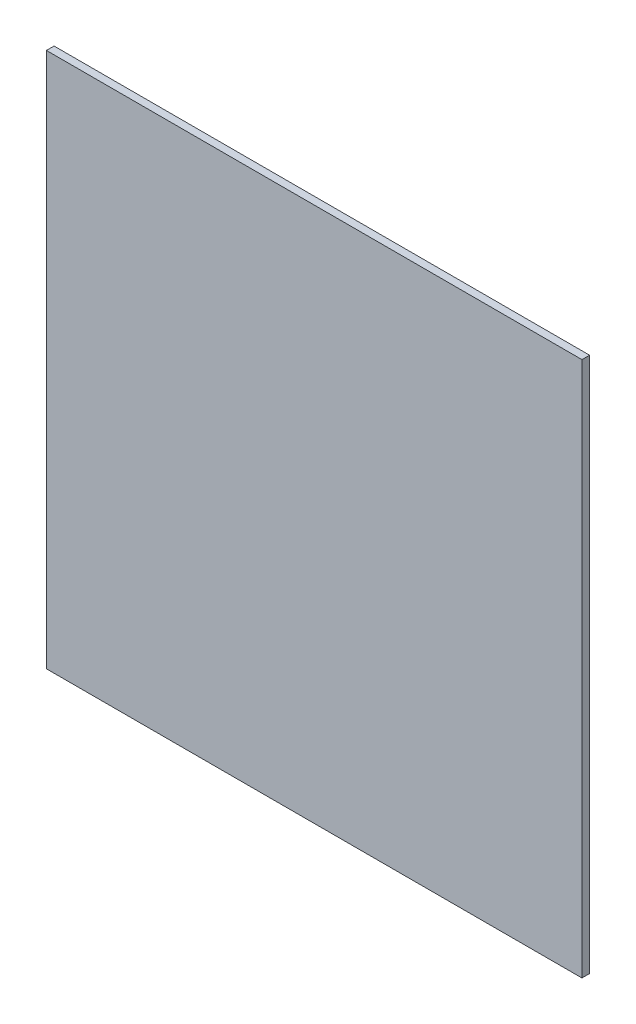
ISO-10303-21;
HEADER;
FILE_DESCRIPTION(('STEP AP214'),'2;1');
FILE_NAME('part.step','',(''),(''),'','','');
FILE_SCHEMA(('AUTOMOTIVE_DESIGN { 1 0 10303 214 1 1 1 1 }'));
ENDSEC;
DATA;
#1=APPLICATION_CONTEXT('core data for automotive mechanical design processes');
#2=APPLICATION_PROTOCOL_DEFINITION('international standard','automotive_design',2000,#1);
#3=PRODUCT_CONTEXT('',#1,'mechanical');
#4=PRODUCT('Part','Part','',(#3));
#5=PRODUCT_RELATED_PRODUCT_CATEGORY('part','',(#4));
#6=PRODUCT_DEFINITION_FORMATION('','',#4);
#7=PRODUCT_DEFINITION_CONTEXT('part definition',#1,'design');
#8=PRODUCT_DEFINITION('design','',#6,#7);
#9=PRODUCT_DEFINITION_SHAPE('','',#8);
#10=(LENGTH_UNIT() NAMED_UNIT(*) SI_UNIT(.MILLI.,.METRE.));
#11=(NAMED_UNIT(*) PLANE_ANGLE_UNIT() SI_UNIT($,.RADIAN.));
#12=(NAMED_UNIT(*) SI_UNIT($,.STERADIAN.) SOLID_ANGLE_UNIT());
#13=UNCERTAINTY_MEASURE_WITH_UNIT(LENGTH_MEASURE(1.E-05),#10,'distance_accuracy_value','');
#14=(GEOMETRIC_REPRESENTATION_CONTEXT(3) GLOBAL_UNCERTAINTY_ASSIGNED_CONTEXT((#13)) GLOBAL_UNIT_ASSIGNED_CONTEXT((#10,
#11,#12)) REPRESENTATION_CONTEXT('',''));
#15=CARTESIAN_POINT('',(0.,0.,0.));
#16=DIRECTION('',(0.,0.,1.));
#17=DIRECTION('',(1.,0.,0.));
#18=AXIS2_PLACEMENT_3D('',#15,#16,#17);
#19=CARTESIAN_POINT('',(-0.531428571429,0.898437666631,0.132857142857));
#20=DIRECTION('',(0.,0.,1.));
#21=DIRECTION('',(1.,0.,0.));
#22=AXIS2_PLACEMENT_3D('',#19,#20,#21);
#23=PLANE('',#22);
#24=DIRECTION('',(1.,0.,0.));
#25=VECTOR('',#24,1.);
#26=CARTESIAN_POINT('',(0.168571428571,1.598437666631,0.132857142857));
#27=LINE('',#26,#25);
#28=CARTESIAN_POINT('',(-0.531428571429,1.598437666631,0.132857142857));
#29=VERTEX_POINT('',#28);
#30=CARTESIAN_POINT('',(0.168571428571,1.598437666631,0.132857142857));
#31=VERTEX_POINT('',#30);
#32=EDGE_CURVE('E81',#29,#31,#27,.T.);
#33=ORIENTED_EDGE('',*,*,#32,.T.);
#34=DIRECTION('',(0.,1.,0.));
#35=VECTOR('',#34,1.);
#36=CARTESIAN_POINT('',(0.168571428571,0.898437666631,0.132857142857));
#37=LINE('',#36,#35);
#38=CARTESIAN_POINT('',(0.168571428571,0.898437666631,0.132857142857));
#39=VERTEX_POINT('',#38);
#40=EDGE_CURVE('E68',#31,#39,#37,.F.);
#41=ORIENTED_EDGE('',*,*,#40,.T.);
#42=DIRECTION('',(1.,0.,0.));
#43=VECTOR('',#42,1.);
#44=CARTESIAN_POINT('',(-0.531428571429,0.898437666631,0.132857142857));
#45=LINE('',#44,#43);
#46=CARTESIAN_POINT('',(-0.531428571429,0.898437666631,0.132857142857));
#47=VERTEX_POINT('',#46);
#48=EDGE_CURVE('E55',#39,#47,#45,.F.);
#49=ORIENTED_EDGE('',*,*,#48,.T.);
#50=DIRECTION('',(0.,1.,0.));
#51=VECTOR('',#50,1.);
#52=CARTESIAN_POINT('',(-0.531428571429,1.598437666631,0.132857142857));
#53=LINE('',#52,#51);
#54=EDGE_CURVE('E20',#47,#29,#53,.T.);
#55=ORIENTED_EDGE('',*,*,#54,.T.);
#56=EDGE_LOOP('',(#33,#41,#49,#55));
#57=FACE_BOUND('',#56,.T.);
#58=ADVANCED_FACE('F17',(#57),#23,.F.);
#59=CARTESIAN_POINT('',(-0.531428571429,1.598437666631,0.142857142857));
#60=DIRECTION('',(1.,0.,0.));
#61=DIRECTION('',(0.,0.,-1.));
#62=AXIS2_PLACEMENT_3D('',#59,#60,#61);
#63=PLANE('',#62);
#64=DIRECTION('',(0.,0.,1.));
#65=VECTOR('',#64,1.);
#66=CARTESIAN_POINT('',(-0.531428571429,0.898437666631,0.142857142857));
#67=LINE('',#66,#65);
#68=CARTESIAN_POINT('',(-0.531428571429,0.898437666631,0.142857142857));
#69=VERTEX_POINT('',#68);
#70=EDGE_CURVE('E61',#47,#69,#67,.T.);
#71=ORIENTED_EDGE('',*,*,#70,.T.);
#72=DIRECTION('',(0.,1.,0.));
#73=VECTOR('',#72,1.);
#74=CARTESIAN_POINT('',(-0.531428571429,0.898437666631,0.142857142857));
#75=LINE('',#74,#73);
#76=CARTESIAN_POINT('',(-0.531428571429,1.598437666631,0.142857142857));
#77=VERTEX_POINT('',#76);
#78=EDGE_CURVE('E83',#77,#69,#75,.F.);
#79=ORIENTED_EDGE('',*,*,#78,.F.);
#80=DIRECTION('',(0.,0.,-1.));
#81=VECTOR('',#80,1.);
#82=CARTESIAN_POINT('',(-0.531428571429,1.598437666631,0.142857142857));
#83=LINE('',#82,#81);
#84=EDGE_CURVE('E64',#77,#29,#83,.T.);
#85=ORIENTED_EDGE('',*,*,#84,.T.);
#86=ORIENTED_EDGE('',*,*,#54,.F.);
#87=EDGE_LOOP('',(#71,#79,#85,#86));
#88=FACE_BOUND('',#87,.T.);
#89=ADVANCED_FACE('F60',(#88),#63,.F.);
#90=CARTESIAN_POINT('',(-0.531428571429,0.898437666631,0.142857142857));
#91=DIRECTION('',(0.,1.,0.));
#92=DIRECTION('',(0.,0.,1.));
#93=AXIS2_PLACEMENT_3D('',#90,#91,#92);
#94=PLANE('',#93);
#95=DIRECTION('',(0.,0.,1.));
#96=VECTOR('',#95,1.);
#97=CARTESIAN_POINT('',(0.168571428571,0.898437666631,0.142857142857));
#98=LINE('',#97,#96);
#99=CARTESIAN_POINT('',(0.168571428571,0.898437666631,0.142857142857));
#100=VERTEX_POINT('',#99);
#101=EDGE_CURVE('E70',#39,#100,#98,.T.);
#102=ORIENTED_EDGE('',*,*,#101,.T.);
#103=DIRECTION('',(1.,0.,0.));
#104=VECTOR('',#103,1.);
#105=CARTESIAN_POINT('',(-0.531428571429,0.898437666631,0.142857142857));
#106=LINE('',#105,#104);
#107=EDGE_CURVE('E74',#69,#100,#106,.T.);
#108=ORIENTED_EDGE('',*,*,#107,.F.);
#109=ORIENTED_EDGE('',*,*,#70,.F.);
#110=ORIENTED_EDGE('',*,*,#48,.F.);
#111=EDGE_LOOP('',(#102,#108,#109,#110));
#112=FACE_BOUND('',#111,.T.);
#113=ADVANCED_FACE('F72',(#112),#94,.F.);
#114=CARTESIAN_POINT('',(0.168571428571,0.898437666631,0.142857142857));
#115=DIRECTION('',(-1.,0.,0.));
#116=DIRECTION('',(0.,0.,1.));
#117=AXIS2_PLACEMENT_3D('',#114,#115,#116);
#118=PLANE('',#117);
#119=DIRECTION('',(0.,0.,-1.));
#120=VECTOR('',#119,1.);
#121=CARTESIAN_POINT('',(0.168571428571,1.598437666631,0.142857142857));
#122=LINE('',#121,#120);
#123=CARTESIAN_POINT('',(0.168571428571,1.598437666631,0.142857142857));
#124=VERTEX_POINT('',#123);
#125=EDGE_CURVE('E35',#31,#124,#122,.F.);
#126=ORIENTED_EDGE('',*,*,#125,.T.);
#127=DIRECTION('',(0.,1.,0.));
#128=VECTOR('',#127,1.);
#129=CARTESIAN_POINT('',(0.168571428571,0.898437666631,0.142857142857));
#130=LINE('',#129,#128);
#131=EDGE_CURVE('E26',#100,#124,#130,.T.);
#132=ORIENTED_EDGE('',*,*,#131,.F.);
#133=ORIENTED_EDGE('',*,*,#101,.F.);
#134=ORIENTED_EDGE('',*,*,#40,.F.);
#135=EDGE_LOOP('',(#126,#132,#133,#134));
#136=FACE_BOUND('',#135,.T.);
#137=ADVANCED_FACE('F89',(#136),#118,.F.);
#138=CARTESIAN_POINT('',(0.168571428571,1.598437666631,0.142857142857));
#139=DIRECTION('',(0.,-1.,0.));
#140=DIRECTION('',(0.,0.,-1.));
#141=AXIS2_PLACEMENT_3D('',#138,#139,#140);
#142=PLANE('',#141);
#143=ORIENTED_EDGE('',*,*,#84,.F.);
#144=DIRECTION('',(1.,0.,0.));
#145=VECTOR('',#144,1.);
#146=CARTESIAN_POINT('',(-0.531428571429,1.598437666631,0.142857142857));
#147=LINE('',#146,#145);
#148=EDGE_CURVE('E11',#124,#77,#147,.F.);
#149=ORIENTED_EDGE('',*,*,#148,.F.);
#150=ORIENTED_EDGE('',*,*,#125,.F.);
#151=ORIENTED_EDGE('',*,*,#32,.F.);
#152=EDGE_LOOP('',(#143,#149,#150,#151));
#153=FACE_BOUND('',#152,.T.);
#154=ADVANCED_FACE('F91',(#153),#142,.F.);
#155=CARTESIAN_POINT('',(-0.531428571429,0.898437666631,0.142857142857));
#156=DIRECTION('',(0.,0.,1.));
#157=DIRECTION('',(1.,0.,0.));
#158=AXIS2_PLACEMENT_3D('',#155,#156,#157);
#159=PLANE('',#158);
#160=ORIENTED_EDGE('',*,*,#131,.T.);
#161=ORIENTED_EDGE('',*,*,#148,.T.);
#162=ORIENTED_EDGE('',*,*,#78,.T.);
#163=ORIENTED_EDGE('',*,*,#107,.T.);
#164=EDGE_LOOP('',(#160,#161,#162,#163));
#165=FACE_BOUND('',#164,.T.);
#166=ADVANCED_FACE('F88',(#165),#159,.T.);
#167=CLOSED_SHELL('',(#58,#89,#113,#137,#154,#166));
#168=MANIFOLD_SOLID_BREP('B1',#167);
#169=ADVANCED_BREP_SHAPE_REPRESENTATION('',(#18,#168),#14);
#170=SHAPE_DEFINITION_REPRESENTATION(#9,#169);
ENDSEC;
END-ISO-10303-21;
